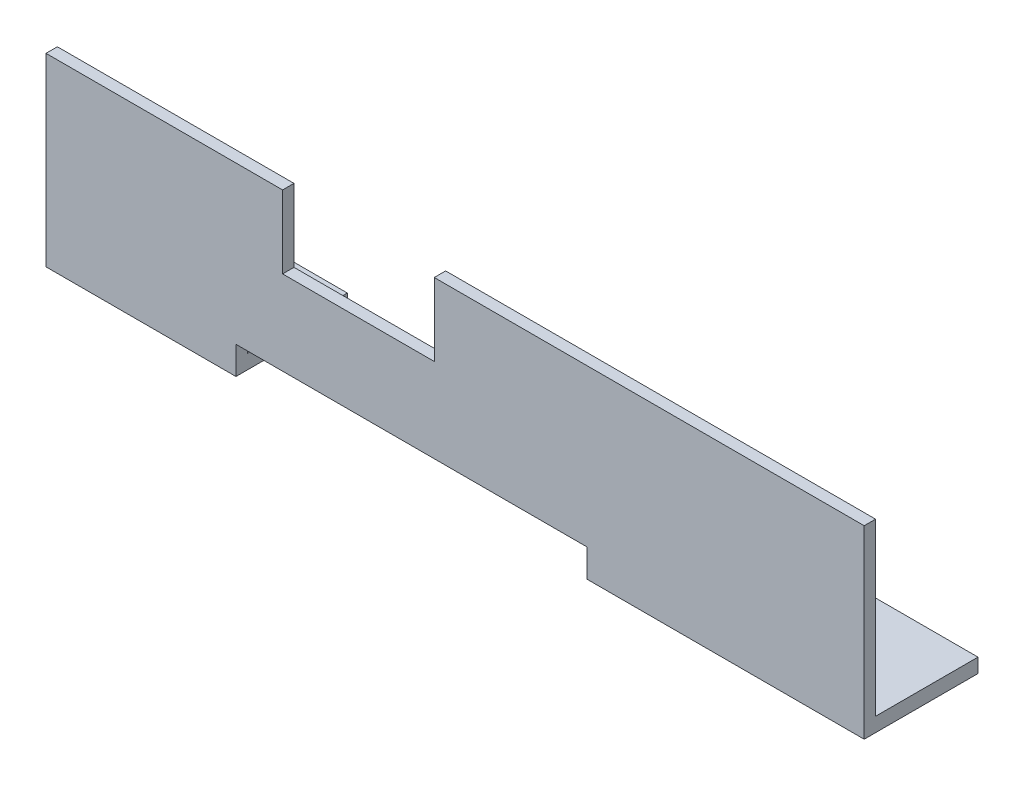
ISO-10303-21;
HEADER;
FILE_DESCRIPTION(('STEP AP214'),'2;1');
FILE_NAME('part.step','',(''),(''),'','','');
FILE_SCHEMA(('AUTOMOTIVE_DESIGN { 1 0 10303 214 1 1 1 1 }'));
ENDSEC;
DATA;
#1=APPLICATION_CONTEXT('core data for automotive mechanical design processes');
#2=APPLICATION_PROTOCOL_DEFINITION('international standard','automotive_design',2000,#1);
#3=PRODUCT_CONTEXT('',#1,'mechanical');
#4=PRODUCT('Part','Part','',(#3));
#5=PRODUCT_RELATED_PRODUCT_CATEGORY('part','',(#4));
#6=PRODUCT_DEFINITION_FORMATION('','',#4);
#7=PRODUCT_DEFINITION_CONTEXT('part definition',#1,'design');
#8=PRODUCT_DEFINITION('design','',#6,#7);
#9=PRODUCT_DEFINITION_SHAPE('','',#8);
#10=(LENGTH_UNIT() NAMED_UNIT(*) SI_UNIT(.MILLI.,.METRE.));
#11=(NAMED_UNIT(*) PLANE_ANGLE_UNIT() SI_UNIT($,.RADIAN.));
#12=(NAMED_UNIT(*) SI_UNIT($,.STERADIAN.) SOLID_ANGLE_UNIT());
#13=UNCERTAINTY_MEASURE_WITH_UNIT(LENGTH_MEASURE(1.E-05),#10,'distance_accuracy_value','');
#14=(GEOMETRIC_REPRESENTATION_CONTEXT(3) GLOBAL_UNCERTAINTY_ASSIGNED_CONTEXT((#13)) GLOBAL_UNIT_ASSIGNED_CONTEXT((#10,
#11,#12)) REPRESENTATION_CONTEXT('',''));
#15=CARTESIAN_POINT('',(0.,0.,0.));
#16=DIRECTION('',(0.,0.,1.));
#17=DIRECTION('',(1.,0.,0.));
#18=AXIS2_PLACEMENT_3D('',#15,#16,#17);
#19=CARTESIAN_POINT('',(363.898215159408,0.,-36.));
#20=DIRECTION('',(0.,0.,1.));
#21=DIRECTION('',(1.,0.,0.));
#22=AXIS2_PLACEMENT_3D('',#19,#20,#21);
#23=PLANE('',#22);
#24=DIRECTION('',(-1.,0.,0.));
#25=VECTOR('',#24,1.);
#26=CARTESIAN_POINT('',(363.898215159408,0.,-36.));
#27=LINE('',#26,#25);
#28=CARTESIAN_POINT('',(65.9252534486805,0.,-36.));
#29=VERTEX_POINT('',#28);
#30=CARTESIAN_POINT('',(0.,0.,-36.));
#31=VERTEX_POINT('',#30);
#32=EDGE_CURVE('E292',#29,#31,#27,.T.);
#33=ORIENTED_EDGE('',*,*,#32,.F.);
#34=DIRECTION('',(0.,-1.,0.));
#35=VECTOR('',#34,1.);
#36=CARTESIAN_POINT('',(65.9252534486804,0.,-36.));
#37=LINE('',#36,#35);
#38=CARTESIAN_POINT('',(65.9252534486805,-5.,-36.));
#39=VERTEX_POINT('',#38);
#40=EDGE_CURVE('E198',#29,#39,#37,.T.);
#41=ORIENTED_EDGE('',*,*,#40,.T.);
#42=DIRECTION('',(-1.,0.,0.));
#43=VECTOR('',#42,1.);
#44=CARTESIAN_POINT('',(363.898215159408,-5.,-36.));
#45=LINE('',#44,#43);
#46=CARTESIAN_POINT('',(0.,-5.,-36.));
#47=VERTEX_POINT('',#46);
#48=EDGE_CURVE('E186',#39,#47,#45,.T.);
#49=ORIENTED_EDGE('',*,*,#48,.T.);
#50=DIRECTION('',(0.,1.,0.));
#51=VECTOR('',#50,1.);
#52=CARTESIAN_POINT('',(0.,0.,-36.));
#53=LINE('',#52,#51);
#54=EDGE_CURVE('E289',#47,#31,#53,.T.);
#55=ORIENTED_EDGE('',*,*,#54,.T.);
#56=EDGE_LOOP('',(#33,#41,#49,#55));
#57=FACE_BOUND('',#56,.T.);
#58=ADVANCED_FACE('F31',(#57),#23,.F.);
#59=CARTESIAN_POINT('',(363.898215159408,60.,4.));
#60=DIRECTION('',(0.,-1.,0.));
#61=DIRECTION('',(0.,0.,-1.));
#62=AXIS2_PLACEMENT_3D('',#59,#60,#61);
#63=PLANE('',#62);
#64=DIRECTION('',(-1.,0.,0.));
#65=VECTOR('',#64,1.);
#66=CARTESIAN_POINT('',(363.898215159408,60.,0.));
#67=LINE('',#66,#65);
#68=CARTESIAN_POINT('',(287.576527547039,60.,0.));
#69=VERTEX_POINT('',#68);
#70=CARTESIAN_POINT('',(136.46677064427,60.,0.));
#71=VERTEX_POINT('',#70);
#72=EDGE_CURVE('E308',#69,#71,#67,.T.);
#73=ORIENTED_EDGE('',*,*,#72,.T.);
#74=DIRECTION('',(0.,0.,1.));
#75=VECTOR('',#74,1.);
#76=CARTESIAN_POINT('',(136.46677064427,60.,4.));
#77=LINE('',#76,#75);
#78=CARTESIAN_POINT('',(136.46677064427,60.,4.));
#79=VERTEX_POINT('',#78);
#80=EDGE_CURVE('E216',#71,#79,#77,.T.);
#81=ORIENTED_EDGE('',*,*,#80,.T.);
#82=DIRECTION('',(-1.,0.,0.));
#83=VECTOR('',#82,1.);
#84=CARTESIAN_POINT('',(363.898215159408,60.,4.));
#85=LINE('',#84,#83);
#86=CARTESIAN_POINT('',(287.576527547039,60.,4.));
#87=VERTEX_POINT('',#86);
#88=EDGE_CURVE('E304',#87,#79,#85,.T.);
#89=ORIENTED_EDGE('',*,*,#88,.F.);
#90=DIRECTION('',(0.,0.,-1.));
#91=VECTOR('',#90,1.);
#92=CARTESIAN_POINT('',(287.576527547039,60.,4.));
#93=LINE('',#92,#91);
#94=EDGE_CURVE('E266',#87,#69,#93,.T.);
#95=ORIENTED_EDGE('',*,*,#94,.T.);
#96=EDGE_LOOP('',(#73,#81,#89,#95));
#97=FACE_BOUND('',#96,.T.);
#98=ADVANCED_FACE('F335',(#97),#63,.F.);
#99=CARTESIAN_POINT('',(0.,0.,-36.));
#100=DIRECTION('',(-1.,0.,0.));
#101=DIRECTION('',(0.,0.,1.));
#102=AXIS2_PLACEMENT_3D('',#99,#100,#101);
#103=PLANE('',#102);
#104=DIRECTION('',(0.,0.,1.));
#105=VECTOR('',#104,1.);
#106=CARTESIAN_POINT('',(0.,0.,0.));
#107=LINE('',#106,#105);
#108=CARTESIAN_POINT('',(0.,0.,0.));
#109=VERTEX_POINT('',#108);
#110=EDGE_CURVE('E258',#31,#109,#107,.T.);
#111=ORIENTED_EDGE('',*,*,#110,.F.);
#112=ORIENTED_EDGE('',*,*,#54,.F.);
#113=DIRECTION('',(0.,0.,-1.));
#114=VECTOR('',#113,1.);
#115=CARTESIAN_POINT('',(0.,-5.,-36.));
#116=LINE('',#115,#114);
#117=CARTESIAN_POINT('',(0.,-5.,4.));
#118=VERTEX_POINT('',#117);
#119=EDGE_CURVE('E287',#118,#47,#116,.T.);
#120=ORIENTED_EDGE('',*,*,#119,.F.);
#121=DIRECTION('',(0.,-1.,0.));
#122=VECTOR('',#121,1.);
#123=CARTESIAN_POINT('',(0.,-5.,4.));
#124=LINE('',#123,#122);
#125=CARTESIAN_POINT('',(0.,60.,4.));
#126=VERTEX_POINT('',#125);
#127=EDGE_CURVE('E284',#126,#118,#124,.T.);
#128=ORIENTED_EDGE('',*,*,#127,.F.);
#129=DIRECTION('',(0.,0.,1.));
#130=VECTOR('',#129,1.);
#131=CARTESIAN_POINT('',(0.,60.,4.));
#132=LINE('',#131,#130);
#133=CARTESIAN_POINT('',(0.,60.,0.));
#134=VERTEX_POINT('',#133);
#135=EDGE_CURVE('E281',#134,#126,#132,.T.);
#136=ORIENTED_EDGE('',*,*,#135,.F.);
#137=DIRECTION('',(0.,1.,0.));
#138=VECTOR('',#137,1.);
#139=CARTESIAN_POINT('',(0.,0.,0.));
#140=LINE('',#139,#138);
#141=EDGE_CURVE('E278',#109,#134,#140,.T.);
#142=ORIENTED_EDGE('',*,*,#141,.F.);
#143=EDGE_LOOP('',(#111,#112,#120,#128,#136,#142));
#144=FACE_BOUND('',#143,.T.);
#145=ADVANCED_FACE('F357',(#144),#103,.T.);
#146=CARTESIAN_POINT('',(287.576527547039,-5.,-36.));
#147=VERTEX_POINT('',#146);
#148=CARTESIAN_POINT('',(154.504635639279,-5.,-36.));
#149=VERTEX_POINT('',#148);
#150=EDGE_CURVE('E296',#147,#149,#45,.T.);
#151=ORIENTED_EDGE('',*,*,#150,.T.);
#152=DIRECTION('',(0.,1.,0.));
#153=VECTOR('',#152,1.);
#154=CARTESIAN_POINT('',(154.504635639279,0.,-36.));
#155=LINE('',#154,#153);
#156=CARTESIAN_POINT('',(154.504635639279,0.,-36.));
#157=VERTEX_POINT('',#156);
#158=EDGE_CURVE('E194',#149,#157,#155,.T.);
#159=ORIENTED_EDGE('',*,*,#158,.T.);
#160=CARTESIAN_POINT('',(287.576527547039,0.,-36.));
#161=VERTEX_POINT('',#160);
#162=EDGE_CURVE('E293',#161,#157,#27,.T.);
#163=ORIENTED_EDGE('',*,*,#162,.F.);
#164=DIRECTION('',(0.,-1.,0.));
#165=VECTOR('',#164,1.);
#166=CARTESIAN_POINT('',(287.576527547039,0.,-36.));
#167=LINE('',#166,#165);
#168=EDGE_CURVE('E263',#161,#147,#167,.T.);
#169=ORIENTED_EDGE('',*,*,#168,.T.);
#170=EDGE_LOOP('',(#151,#159,#163,#169));
#171=FACE_BOUND('',#170,.T.);
#172=ADVANCED_FACE('F387',(#171),#23,.F.);
#173=CARTESIAN_POINT('',(363.898215159408,-5.,-36.));
#174=DIRECTION('',(0.,1.,0.));
#175=DIRECTION('',(0.,0.,1.));
#176=AXIS2_PLACEMENT_3D('',#173,#174,#175);
#177=PLANE('',#176);
#178=ORIENTED_EDGE('',*,*,#48,.F.);
#179=DIRECTION('',(0.,0.,1.));
#180=VECTOR('',#179,1.);
#181=CARTESIAN_POINT('',(65.9252534486805,-5.,-36.882091371911));
#182=LINE('',#181,#180);
#183=CARTESIAN_POINT('',(65.9252534486805,-5.,-29.8997907664697));
#184=VERTEX_POINT('',#183);
#185=EDGE_CURVE('E170',#39,#184,#182,.T.);
#186=ORIENTED_EDGE('',*,*,#185,.T.);
#187=DIRECTION('',(1.,0.,0.));
#188=VECTOR('',#187,1.);
#189=CARTESIAN_POINT('',(65.9252534486805,-5.,-29.8997907664697));
#190=LINE('',#189,#188);
#191=CARTESIAN_POINT('',(154.504635639279,-5.,-29.8997907664697));
#192=VERTEX_POINT('',#191);
#193=EDGE_CURVE('E177',#184,#192,#190,.T.);
#194=ORIENTED_EDGE('',*,*,#193,.T.);
#195=DIRECTION('',(0.,0.,-1.));
#196=VECTOR('',#195,1.);
#197=CARTESIAN_POINT('',(154.504635639279,-5.,-36.882091371911));
#198=LINE('',#197,#196);
#199=EDGE_CURVE('E174',#192,#149,#198,.T.);
#200=ORIENTED_EDGE('',*,*,#199,.T.);
#201=ORIENTED_EDGE('',*,*,#150,.F.);
#202=DIRECTION('',(0.,0.,1.));
#203=VECTOR('',#202,1.);
#204=CARTESIAN_POINT('',(287.576527547039,-5.,-36.));
#205=LINE('',#204,#203);
#206=CARTESIAN_POINT('',(287.576527547039,-5.,4.));
#207=VERTEX_POINT('',#206);
#208=EDGE_CURVE('E259',#147,#207,#205,.T.);
#209=ORIENTED_EDGE('',*,*,#208,.T.);
#210=DIRECTION('',(-1.,0.,0.));
#211=VECTOR('',#210,1.);
#212=CARTESIAN_POINT('',(363.898215159408,-5.,4.));
#213=LINE('',#212,#211);
#214=CARTESIAN_POINT('',(190.222764034532,-5.,4.));
#215=VERTEX_POINT('',#214);
#216=EDGE_CURVE('E300',#207,#215,#213,.T.);
#217=ORIENTED_EDGE('',*,*,#216,.T.);
#218=DIRECTION('',(0.,0.,-1.));
#219=VECTOR('',#218,1.);
#220=CARTESIAN_POINT('',(190.222764034532,-5.,-36.));
#221=LINE('',#220,#219);
#222=CARTESIAN_POINT('',(190.222764034532,-5.,-16.));
#223=VERTEX_POINT('',#222);
#224=EDGE_CURVE('E255',#215,#223,#221,.T.);
#225=ORIENTED_EDGE('',*,*,#224,.T.);
#226=DIRECTION('',(-1.,0.,0.));
#227=VECTOR('',#226,1.);
#228=CARTESIAN_POINT('',(363.898215159408,-5.,-16.));
#229=LINE('',#228,#227);
#230=CARTESIAN_POINT('',(66.7627329768061,-5.,-16.));
#231=VERTEX_POINT('',#230);
#232=EDGE_CURVE('E241',#223,#231,#229,.T.);
#233=ORIENTED_EDGE('',*,*,#232,.T.);
#234=DIRECTION('',(0.,0.,1.));
#235=VECTOR('',#234,1.);
#236=CARTESIAN_POINT('',(66.7627329768061,-5.,-36.));
#237=LINE('',#236,#235);
#238=CARTESIAN_POINT('',(66.7627329768061,-5.,4.));
#239=VERTEX_POINT('',#238);
#240=EDGE_CURVE('E249',#231,#239,#237,.T.);
#241=ORIENTED_EDGE('',*,*,#240,.T.);
#242=EDGE_CURVE('E299',#239,#118,#213,.T.);
#243=ORIENTED_EDGE('',*,*,#242,.T.);
#244=ORIENTED_EDGE('',*,*,#119,.T.);
#245=EDGE_LOOP('',(#178,#186,#194,#200,#201,#209,#217,#225,#233,#241,#243,#244));
#246=FACE_BOUND('',#245,.T.);
#247=ADVANCED_FACE('F184',(#246),#177,.F.);
#248=CARTESIAN_POINT('',(363.898215159408,-5.,4.));
#249=DIRECTION('',(0.,0.,-1.));
#250=DIRECTION('',(0.,1.,0.));
#251=AXIS2_PLACEMENT_3D('',#248,#249,#250);
#252=PLANE('',#251);
#253=ORIENTED_EDGE('',*,*,#88,.T.);
#254=DIRECTION('',(0.,-1.,0.));
#255=VECTOR('',#254,1.);
#256=CARTESIAN_POINT('',(136.46677064427,-5.,4.));
#257=LINE('',#256,#255);
#258=CARTESIAN_POINT('',(136.46677064427,34.4358469767933,4.));
#259=VERTEX_POINT('',#258);
#260=EDGE_CURVE('E219',#79,#259,#257,.T.);
#261=ORIENTED_EDGE('',*,*,#260,.T.);
#262=DIRECTION('',(-1.,0.,0.));
#263=VECTOR('',#262,1.);
#264=CARTESIAN_POINT('',(363.898215159408,34.4358469767933,4.));
#265=LINE('',#264,#263);
#266=CARTESIAN_POINT('',(83.1623489138179,34.4358469767933,4.));
#267=VERTEX_POINT('',#266);
#268=EDGE_CURVE('E206',#259,#267,#265,.T.);
#269=ORIENTED_EDGE('',*,*,#268,.T.);
#270=DIRECTION('',(0.,1.,0.));
#271=VECTOR('',#270,1.);
#272=CARTESIAN_POINT('',(83.1623489138179,-5.,4.));
#273=LINE('',#272,#271);
#274=CARTESIAN_POINT('',(83.1623489138179,60.,4.));
#275=VERTEX_POINT('',#274);
#276=EDGE_CURVE('E213',#267,#275,#273,.T.);
#277=ORIENTED_EDGE('',*,*,#276,.T.);
#278=EDGE_CURVE('E303',#275,#126,#85,.T.);
#279=ORIENTED_EDGE('',*,*,#278,.T.);
#280=ORIENTED_EDGE('',*,*,#127,.T.);
#281=ORIENTED_EDGE('',*,*,#242,.F.);
#282=DIRECTION('',(0.,1.,0.));
#283=VECTOR('',#282,1.);
#284=CARTESIAN_POINT('',(66.7627329768061,4.81963324011372,4.));
#285=LINE('',#284,#283);
#286=CARTESIAN_POINT('',(66.7627329768061,4.81963324011372,4.));
#287=VERTEX_POINT('',#286);
#288=EDGE_CURVE('E226',#239,#287,#285,.T.);
#289=ORIENTED_EDGE('',*,*,#288,.T.);
#290=DIRECTION('',(1.,0.,0.));
#291=VECTOR('',#290,1.);
#292=CARTESIAN_POINT('',(190.222764034532,4.81963324011372,4.));
#293=LINE('',#292,#291);
#294=CARTESIAN_POINT('',(190.222764034532,4.81963324011372,4.));
#295=VERTEX_POINT('',#294);
#296=EDGE_CURVE('E230',#287,#295,#293,.T.);
#297=ORIENTED_EDGE('',*,*,#296,.T.);
#298=DIRECTION('',(0.,-1.,0.));
#299=VECTOR('',#298,1.);
#300=CARTESIAN_POINT('',(190.222764034532,4.81963324011372,4.));
#301=LINE('',#300,#299);
#302=EDGE_CURVE('E223',#295,#215,#301,.T.);
#303=ORIENTED_EDGE('',*,*,#302,.T.);
#304=ORIENTED_EDGE('',*,*,#216,.F.);
#305=DIRECTION('',(0.,1.,0.));
#306=VECTOR('',#305,1.);
#307=CARTESIAN_POINT('',(287.576527547039,-5.,4.));
#308=LINE('',#307,#306);
#309=EDGE_CURVE('E262',#207,#87,#308,.T.);
#310=ORIENTED_EDGE('',*,*,#309,.T.);
#311=EDGE_LOOP('',(#253,#261,#269,#277,#279,#280,#281,#289,#297,#303,#304,#310));
#312=FACE_BOUND('',#311,.T.);
#313=ADVANCED_FACE('F369',(#312),#252,.F.);
#314=ORIENTED_EDGE('',*,*,#278,.F.);
#315=DIRECTION('',(0.,0.,-1.));
#316=VECTOR('',#315,1.);
#317=CARTESIAN_POINT('',(83.1623489138179,60.,4.));
#318=LINE('',#317,#316);
#319=CARTESIAN_POINT('',(83.1623489138179,60.,0.));
#320=VERTEX_POINT('',#319);
#321=EDGE_CURVE('E210',#275,#320,#318,.T.);
#322=ORIENTED_EDGE('',*,*,#321,.T.);
#323=EDGE_CURVE('E307',#320,#134,#67,.T.);
#324=ORIENTED_EDGE('',*,*,#323,.T.);
#325=ORIENTED_EDGE('',*,*,#135,.T.);
#326=EDGE_LOOP('',(#314,#322,#324,#325));
#327=FACE_BOUND('',#326,.T.);
#328=ADVANCED_FACE('F364',(#327),#63,.F.);
#329=CARTESIAN_POINT('',(363.898215159408,0.,0.));
#330=DIRECTION('',(0.,0.,1.));
#331=DIRECTION('',(1.,0.,0.));
#332=AXIS2_PLACEMENT_3D('',#329,#330,#331);
#333=PLANE('',#332);
#334=DIRECTION('',(-1.,0.,0.));
#335=VECTOR('',#334,1.);
#336=CARTESIAN_POINT('',(136.46677064427,34.4358469767933,0.));
#337=LINE('',#336,#335);
#338=CARTESIAN_POINT('',(136.46677064427,34.4358469767933,0.));
#339=VERTEX_POINT('',#338);
#340=CARTESIAN_POINT('',(83.1623489138179,34.4358469767933,0.));
#341=VERTEX_POINT('',#340);
#342=EDGE_CURVE('E200',#339,#341,#337,.T.);
#343=ORIENTED_EDGE('',*,*,#342,.F.);
#344=DIRECTION('',(0.,1.,0.));
#345=VECTOR('',#344,1.);
#346=CARTESIAN_POINT('',(136.46677064427,0.,0.));
#347=LINE('',#346,#345);
#348=EDGE_CURVE('E39',#339,#71,#347,.T.);
#349=ORIENTED_EDGE('',*,*,#348,.T.);
#350=ORIENTED_EDGE('',*,*,#72,.F.);
#351=DIRECTION('',(0.,-1.,0.));
#352=VECTOR('',#351,1.);
#353=CARTESIAN_POINT('',(287.576527547039,0.,0.));
#354=LINE('',#353,#352);
#355=CARTESIAN_POINT('',(287.576527547039,0.,0.));
#356=VERTEX_POINT('',#355);
#357=EDGE_CURVE('E269',#69,#356,#354,.T.);
#358=ORIENTED_EDGE('',*,*,#357,.T.);
#359=DIRECTION('',(-1.,0.,0.));
#360=VECTOR('',#359,1.);
#361=CARTESIAN_POINT('',(363.898215159408,0.,0.));
#362=LINE('',#361,#360);
#363=CARTESIAN_POINT('',(190.222764034532,0.,0.));
#364=VERTEX_POINT('',#363);
#365=EDGE_CURVE('E312',#356,#364,#362,.T.);
#366=ORIENTED_EDGE('',*,*,#365,.T.);
#367=DIRECTION('',(0.,1.,0.));
#368=VECTOR('',#367,1.);
#369=CARTESIAN_POINT('',(190.222764034532,0.,0.));
#370=LINE('',#369,#368);
#371=CARTESIAN_POINT('',(190.222764034532,4.81963324011372,0.));
#372=VERTEX_POINT('',#371);
#373=EDGE_CURVE('E252',#364,#372,#370,.T.);
#374=ORIENTED_EDGE('',*,*,#373,.T.);
#375=DIRECTION('',(-1.,0.,0.));
#376=VECTOR('',#375,1.);
#377=CARTESIAN_POINT('',(363.898215159408,4.81963324011372,0.));
#378=LINE('',#377,#376);
#379=CARTESIAN_POINT('',(66.7627329768061,4.81963324011372,0.));
#380=VERTEX_POINT('',#379);
#381=EDGE_CURVE('E325',#372,#380,#378,.T.);
#382=ORIENTED_EDGE('',*,*,#381,.T.);
#383=DIRECTION('',(0.,-1.,0.));
#384=VECTOR('',#383,1.);
#385=CARTESIAN_POINT('',(66.7627329768061,0.,0.));
#386=LINE('',#385,#384);
#387=CARTESIAN_POINT('',(66.7627329768061,0.,0.));
#388=VERTEX_POINT('',#387);
#389=EDGE_CURVE('E246',#380,#388,#386,.T.);
#390=ORIENTED_EDGE('',*,*,#389,.T.);
#391=EDGE_CURVE('E311',#388,#109,#362,.T.);
#392=ORIENTED_EDGE('',*,*,#391,.T.);
#393=ORIENTED_EDGE('',*,*,#141,.T.);
#394=ORIENTED_EDGE('',*,*,#323,.F.);
#395=DIRECTION('',(0.,1.,0.));
#396=VECTOR('',#395,1.);
#397=CARTESIAN_POINT('',(83.1623489138179,64.4867728969471,0.));
#398=LINE('',#397,#396);
#399=EDGE_CURVE('E202',#341,#320,#398,.T.);
#400=ORIENTED_EDGE('',*,*,#399,.F.);
#401=EDGE_LOOP('',(#343,#349,#350,#358,#366,#374,#382,#390,#392,#393,#394,#400));
#402=FACE_BOUND('',#401,.T.);
#403=ADVANCED_FACE('F331',(#402),#333,.F.);
#404=CARTESIAN_POINT('',(363.898215159408,0.,0.));
#405=DIRECTION('',(0.,-1.,0.));
#406=DIRECTION('',(0.,0.,-1.));
#407=AXIS2_PLACEMENT_3D('',#404,#405,#406);
#408=PLANE('',#407);
#409=DIRECTION('',(1.,0.,0.));
#410=VECTOR('',#409,1.);
#411=CARTESIAN_POINT('',(65.9252534486805,0.,-29.8997907664697));
#412=LINE('',#411,#410);
#413=CARTESIAN_POINT('',(65.9252534486804,0.,-29.8997907664697));
#414=VERTEX_POINT('',#413);
#415=CARTESIAN_POINT('',(154.504635639279,0.,-29.8997907664697));
#416=VERTEX_POINT('',#415);
#417=EDGE_CURVE('E189',#414,#416,#412,.T.);
#418=ORIENTED_EDGE('',*,*,#417,.F.);
#419=DIRECTION('',(0.,0.,-1.));
#420=VECTOR('',#419,1.);
#421=CARTESIAN_POINT('',(65.9252534486804,0.,0.));
#422=LINE('',#421,#420);
#423=EDGE_CURVE('E11',#414,#29,#422,.T.);
#424=ORIENTED_EDGE('',*,*,#423,.T.);
#425=ORIENTED_EDGE('',*,*,#32,.T.);
#426=ORIENTED_EDGE('',*,*,#110,.T.);
#427=ORIENTED_EDGE('',*,*,#391,.F.);
#428=DIRECTION('',(0.,0.,-1.));
#429=VECTOR('',#428,1.);
#430=CARTESIAN_POINT('',(66.7627329768061,0.,0.));
#431=LINE('',#430,#429);
#432=CARTESIAN_POINT('',(66.7627329768061,0.,-16.));
#433=VERTEX_POINT('',#432);
#434=EDGE_CURVE('E319',#388,#433,#431,.T.);
#435=ORIENTED_EDGE('',*,*,#434,.T.);
#436=DIRECTION('',(1.,0.,0.));
#437=VECTOR('',#436,1.);
#438=CARTESIAN_POINT('',(363.898215159408,0.,-16.));
#439=LINE('',#438,#437);
#440=CARTESIAN_POINT('',(190.222764034532,0.,-16.));
#441=VERTEX_POINT('',#440);
#442=EDGE_CURVE('E275',#433,#441,#439,.T.);
#443=ORIENTED_EDGE('',*,*,#442,.T.);
#444=DIRECTION('',(0.,0.,1.));
#445=VECTOR('',#444,1.);
#446=CARTESIAN_POINT('',(190.222764034532,0.,0.));
#447=LINE('',#446,#445);
#448=EDGE_CURVE('E322',#441,#364,#447,.T.);
#449=ORIENTED_EDGE('',*,*,#448,.T.);
#450=ORIENTED_EDGE('',*,*,#365,.F.);
#451=DIRECTION('',(0.,0.,-1.));
#452=VECTOR('',#451,1.);
#453=CARTESIAN_POINT('',(287.576527547039,0.,0.));
#454=LINE('',#453,#452);
#455=EDGE_CURVE('E272',#356,#161,#454,.T.);
#456=ORIENTED_EDGE('',*,*,#455,.T.);
#457=ORIENTED_EDGE('',*,*,#162,.T.);
#458=DIRECTION('',(0.,0.,-1.));
#459=VECTOR('',#458,1.);
#460=CARTESIAN_POINT('',(154.504635639279,0.,-36.882091371911));
#461=LINE('',#460,#459);
#462=EDGE_CURVE('E187',#416,#157,#461,.T.);
#463=ORIENTED_EDGE('',*,*,#462,.F.);
#464=EDGE_LOOP('',(#418,#424,#425,#426,#427,#435,#443,#449,#450,#456,#457,#463));
#465=FACE_BOUND('',#464,.T.);
#466=ADVANCED_FACE('F33',(#465),#408,.F.);
#467=CARTESIAN_POINT('',(287.576527547039,598.230303623996,4.09772164234155));
#468=DIRECTION('',(-1.,0.,0.));
#469=DIRECTION('',(0.,0.,1.));
#470=AXIS2_PLACEMENT_3D('',#467,#468,#469);
#471=PLANE('',#470);
#472=ORIENTED_EDGE('',*,*,#357,.F.);
#473=ORIENTED_EDGE('',*,*,#94,.F.);
#474=ORIENTED_EDGE('',*,*,#309,.F.);
#475=ORIENTED_EDGE('',*,*,#208,.F.);
#476=ORIENTED_EDGE('',*,*,#168,.F.);
#477=ORIENTED_EDGE('',*,*,#455,.F.);
#478=EDGE_LOOP('',(#472,#473,#474,#475,#476,#477));
#479=FACE_BOUND('',#478,.T.);
#480=ADVANCED_FACE('F338',(#479),#471,.F.);
#481=CARTESIAN_POINT('',(190.222764034532,4.81963324011372,4.));
#482=DIRECTION('',(0.,1.,0.));
#483=DIRECTION('',(0.,0.,1.));
#484=AXIS2_PLACEMENT_3D('',#481,#482,#483);
#485=PLANE('',#484);
#486=DIRECTION('',(0.,0.,-1.));
#487=VECTOR('',#486,1.);
#488=CARTESIAN_POINT('',(190.222764034532,4.81963324011372,4.));
#489=LINE('',#488,#487);
#490=EDGE_CURVE('E238',#295,#372,#489,.T.);
#491=ORIENTED_EDGE('',*,*,#490,.F.);
#492=ORIENTED_EDGE('',*,*,#296,.F.);
#493=DIRECTION('',(0.,0.,-1.));
#494=VECTOR('',#493,1.);
#495=CARTESIAN_POINT('',(66.7627329768061,4.81963324011372,4.));
#496=LINE('',#495,#494);
#497=EDGE_CURVE('E233',#287,#380,#496,.T.);
#498=ORIENTED_EDGE('',*,*,#497,.T.);
#499=ORIENTED_EDGE('',*,*,#381,.F.);
#500=EDGE_LOOP('',(#491,#492,#498,#499));
#501=FACE_BOUND('',#500,.T.);
#502=ADVANCED_FACE('F348',(#501),#485,.F.);
#503=CARTESIAN_POINT('',(190.222764034532,4.81963324011372,4.));
#504=DIRECTION('',(1.,0.,0.));
#505=DIRECTION('',(0.,0.,-1.));
#506=AXIS2_PLACEMENT_3D('',#503,#504,#505);
#507=PLANE('',#506);
#508=ORIENTED_EDGE('',*,*,#302,.F.);
#509=ORIENTED_EDGE('',*,*,#490,.T.);
#510=ORIENTED_EDGE('',*,*,#373,.F.);
#511=ORIENTED_EDGE('',*,*,#448,.F.);
#512=DIRECTION('',(0.,-1.,0.));
#513=VECTOR('',#512,1.);
#514=CARTESIAN_POINT('',(190.222764034532,4.81963324011372,-16.));
#515=LINE('',#514,#513);
#516=EDGE_CURVE('E222',#441,#223,#515,.T.);
#517=ORIENTED_EDGE('',*,*,#516,.T.);
#518=ORIENTED_EDGE('',*,*,#224,.F.);
#519=EDGE_LOOP('',(#508,#509,#510,#511,#517,#518));
#520=FACE_BOUND('',#519,.T.);
#521=ADVANCED_FACE('F346',(#520),#507,.F.);
#522=CARTESIAN_POINT('',(66.7627329768061,4.81963324011372,4.));
#523=DIRECTION('',(-1.,0.,0.));
#524=DIRECTION('',(0.,0.,1.));
#525=AXIS2_PLACEMENT_3D('',#522,#523,#524);
#526=PLANE('',#525);
#527=DIRECTION('',(0.,1.,0.));
#528=VECTOR('',#527,1.);
#529=CARTESIAN_POINT('',(66.7627329768061,4.81963324011372,-16.));
#530=LINE('',#529,#528);
#531=EDGE_CURVE('E227',#231,#433,#530,.T.);
#532=ORIENTED_EDGE('',*,*,#531,.T.);
#533=ORIENTED_EDGE('',*,*,#434,.F.);
#534=ORIENTED_EDGE('',*,*,#389,.F.);
#535=ORIENTED_EDGE('',*,*,#497,.F.);
#536=ORIENTED_EDGE('',*,*,#288,.F.);
#537=ORIENTED_EDGE('',*,*,#240,.F.);
#538=EDGE_LOOP('',(#532,#533,#534,#535,#536,#537));
#539=FACE_BOUND('',#538,.T.);
#540=ADVANCED_FACE('F380',(#539),#526,.F.);
#541=CARTESIAN_POINT('',(190.222764034532,-10.7550054393109,-16.));
#542=DIRECTION('',(0.,0.,-1.));
#543=DIRECTION('',(-1.,0.,0.));
#544=AXIS2_PLACEMENT_3D('',#541,#542,#543);
#545=PLANE('',#544);
#546=ORIENTED_EDGE('',*,*,#516,.F.);
#547=ORIENTED_EDGE('',*,*,#442,.F.);
#548=ORIENTED_EDGE('',*,*,#531,.F.);
#549=ORIENTED_EDGE('',*,*,#232,.F.);
#550=EDGE_LOOP('',(#546,#547,#548,#549));
#551=FACE_BOUND('',#550,.T.);
#552=ADVANCED_FACE('F373',(#551),#545,.F.);
#553=CARTESIAN_POINT('',(136.46677064427,64.4867728969471,40.));
#554=DIRECTION('',(1.,0.,0.));
#555=DIRECTION('',(0.,0.,-1.));
#556=AXIS2_PLACEMENT_3D('',#553,#554,#555);
#557=PLANE('',#556);
#558=ORIENTED_EDGE('',*,*,#80,.F.);
#559=ORIENTED_EDGE('',*,*,#348,.F.);
#560=DIRECTION('',(0.,0.,-1.));
#561=VECTOR('',#560,1.);
#562=CARTESIAN_POINT('',(136.46677064427,34.4358469767933,40.));
#563=LINE('',#562,#561);
#564=EDGE_CURVE('E54',#259,#339,#563,.T.);
#565=ORIENTED_EDGE('',*,*,#564,.F.);
#566=ORIENTED_EDGE('',*,*,#260,.F.);
#567=EDGE_LOOP('',(#558,#559,#565,#566));
#568=FACE_BOUND('',#567,.T.);
#569=ADVANCED_FACE('F371',(#568),#557,.F.);
#570=CARTESIAN_POINT('',(83.1623489138179,64.4867728969471,40.));
#571=DIRECTION('',(-1.,0.,0.));
#572=DIRECTION('',(0.,0.,1.));
#573=AXIS2_PLACEMENT_3D('',#570,#571,#572);
#574=PLANE('',#573);
#575=DIRECTION('',(0.,0.,-1.));
#576=VECTOR('',#575,1.);
#577=CARTESIAN_POINT('',(83.1623489138179,34.4358469767933,40.));
#578=LINE('',#577,#576);
#579=EDGE_CURVE('E204',#267,#341,#578,.T.);
#580=ORIENTED_EDGE('',*,*,#579,.T.);
#581=ORIENTED_EDGE('',*,*,#399,.T.);
#582=ORIENTED_EDGE('',*,*,#321,.F.);
#583=ORIENTED_EDGE('',*,*,#276,.F.);
#584=EDGE_LOOP('',(#580,#581,#582,#583));
#585=FACE_BOUND('',#584,.T.);
#586=ADVANCED_FACE('F366',(#585),#574,.F.);
#587=CARTESIAN_POINT('',(136.46677064427,34.4358469767933,40.));
#588=DIRECTION('',(0.,-1.,0.));
#589=DIRECTION('',(0.,0.,-1.));
#590=AXIS2_PLACEMENT_3D('',#587,#588,#589);
#591=PLANE('',#590);
#592=ORIENTED_EDGE('',*,*,#564,.T.);
#593=ORIENTED_EDGE('',*,*,#342,.T.);
#594=ORIENTED_EDGE('',*,*,#579,.F.);
#595=ORIENTED_EDGE('',*,*,#268,.F.);
#596=EDGE_LOOP('',(#592,#593,#594,#595));
#597=FACE_BOUND('',#596,.T.);
#598=ADVANCED_FACE('F370',(#597),#591,.F.);
#599=CARTESIAN_POINT('',(65.9252534486805,-5.,-36.882091371911));
#600=DIRECTION('',(-1.,0.,0.));
#601=DIRECTION('',(0.,0.,1.));
#602=AXIS2_PLACEMENT_3D('',#599,#600,#601);
#603=PLANE('',#602);
#604=ORIENTED_EDGE('',*,*,#423,.F.);
#605=DIRECTION('',(0.,1.,0.));
#606=VECTOR('',#605,1.);
#607=CARTESIAN_POINT('',(65.9252534486805,-5.,-29.8997907664697));
#608=LINE('',#607,#606);
#609=EDGE_CURVE('E46',#184,#414,#608,.T.);
#610=ORIENTED_EDGE('',*,*,#609,.F.);
#611=ORIENTED_EDGE('',*,*,#185,.F.);
#612=ORIENTED_EDGE('',*,*,#40,.F.);
#613=EDGE_LOOP('',(#604,#610,#611,#612));
#614=FACE_BOUND('',#613,.T.);
#615=ADVANCED_FACE('F168',(#614),#603,.F.);
#616=CARTESIAN_POINT('',(154.504635639279,-5.,-36.882091371911));
#617=DIRECTION('',(1.,0.,0.));
#618=DIRECTION('',(0.,0.,-1.));
#619=AXIS2_PLACEMENT_3D('',#616,#617,#618);
#620=PLANE('',#619);
#621=ORIENTED_EDGE('',*,*,#199,.F.);
#622=DIRECTION('',(0.,1.,0.));
#623=VECTOR('',#622,1.);
#624=CARTESIAN_POINT('',(154.504635639279,-5.,-29.8997907664697));
#625=LINE('',#624,#623);
#626=EDGE_CURVE('E173',#192,#416,#625,.T.);
#627=ORIENTED_EDGE('',*,*,#626,.T.);
#628=ORIENTED_EDGE('',*,*,#462,.T.);
#629=ORIENTED_EDGE('',*,*,#158,.F.);
#630=EDGE_LOOP('',(#621,#627,#628,#629));
#631=FACE_BOUND('',#630,.T.);
#632=ADVANCED_FACE('F403',(#631),#620,.F.);
#633=CARTESIAN_POINT('',(65.9252534486805,-5.,-29.8997907664697));
#634=DIRECTION('',(0.,0.,1.));
#635=DIRECTION('',(1.,0.,0.));
#636=AXIS2_PLACEMENT_3D('',#633,#634,#635);
#637=PLANE('',#636);
#638=ORIENTED_EDGE('',*,*,#417,.T.);
#639=ORIENTED_EDGE('',*,*,#626,.F.);
#640=ORIENTED_EDGE('',*,*,#193,.F.);
#641=ORIENTED_EDGE('',*,*,#609,.T.);
#642=EDGE_LOOP('',(#638,#639,#640,#641));
#643=FACE_BOUND('',#642,.T.);
#644=ADVANCED_FACE('F178',(#643),#637,.F.);
#645=CLOSED_SHELL('',(#58,#98,#145,#172,#247,#313,#328,#403,#466,#480,#502,#521,#540,#552,#569,
#586,#598,#615,#632,#644));
#646=MANIFOLD_SOLID_BREP('B2',#645);
#647=ADVANCED_BREP_SHAPE_REPRESENTATION('',(#18,#646),#14);
#648=SHAPE_DEFINITION_REPRESENTATION(#9,#647);
ENDSEC;
END-ISO-10303-21;
